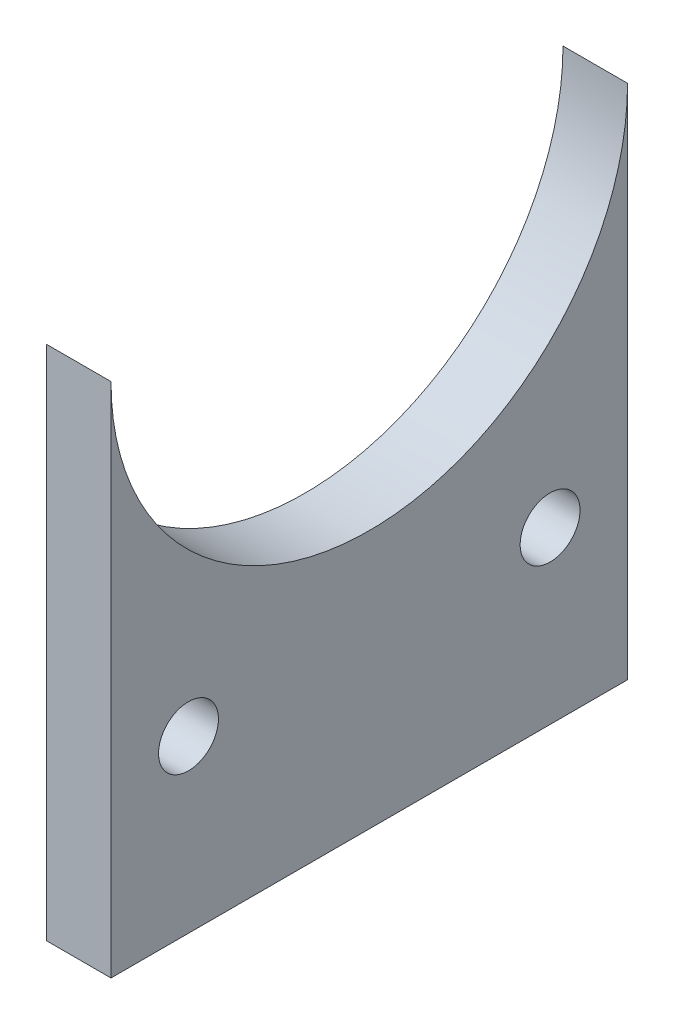
ISO-10303-21;
HEADER;
FILE_DESCRIPTION(('STEP AP214'),'2;1');
FILE_NAME('part.step','',(''),(''),'','','');
FILE_SCHEMA(('AUTOMOTIVE_DESIGN { 1 0 10303 214 1 1 1 1 }'));
ENDSEC;
DATA;
#1=APPLICATION_CONTEXT('core data for automotive mechanical design processes');
#2=APPLICATION_PROTOCOL_DEFINITION('international standard','automotive_design',2000,#1);
#3=PRODUCT_CONTEXT('',#1,'mechanical');
#4=PRODUCT('Part','Part','',(#3));
#5=PRODUCT_RELATED_PRODUCT_CATEGORY('part','',(#4));
#6=PRODUCT_DEFINITION_FORMATION('','',#4);
#7=PRODUCT_DEFINITION_CONTEXT('part definition',#1,'design');
#8=PRODUCT_DEFINITION('design','',#6,#7);
#9=PRODUCT_DEFINITION_SHAPE('','',#8);
#10=(LENGTH_UNIT() NAMED_UNIT(*) SI_UNIT(.MILLI.,.METRE.));
#11=(NAMED_UNIT(*) PLANE_ANGLE_UNIT() SI_UNIT($,.RADIAN.));
#12=(NAMED_UNIT(*) SI_UNIT($,.STERADIAN.) SOLID_ANGLE_UNIT());
#13=UNCERTAINTY_MEASURE_WITH_UNIT(LENGTH_MEASURE(1.E-05),#10,'distance_accuracy_value','');
#14=(GEOMETRIC_REPRESENTATION_CONTEXT(3) GLOBAL_UNCERTAINTY_ASSIGNED_CONTEXT((#13)) GLOBAL_UNIT_ASSIGNED_CONTEXT((#10,
#11,#12)) REPRESENTATION_CONTEXT('',''));
#15=CARTESIAN_POINT('',(0.,0.,0.));
#16=DIRECTION('',(0.,0.,1.));
#17=DIRECTION('',(1.,0.,0.));
#18=AXIS2_PLACEMENT_3D('',#15,#16,#17);
#19=CARTESIAN_POINT('',(3.175,12.7,0.));
#20=DIRECTION('',(-1.,0.,0.));
#21=DIRECTION('',(0.,0.,1.));
#22=AXIS2_PLACEMENT_3D('',#19,#20,#21);
#23=CYLINDRICAL_SURFACE('',#22,12.7);
#24=CARTESIAN_POINT('',(0.,12.7,0.));
#25=DIRECTION('',(-1.,0.,0.));
#26=DIRECTION('',(0.,0.,-1.));
#27=AXIS2_PLACEMENT_3D('',#24,#25,#26);
#28=CIRCLE('',#27,12.7);
#29=CARTESIAN_POINT('',(0.,12.7,-12.7));
#30=VERTEX_POINT('',#29);
#31=CARTESIAN_POINT('',(0.,12.7,12.7));
#32=VERTEX_POINT('',#31);
#33=EDGE_CURVE('E105',#30,#32,#28,.T.);
#34=ORIENTED_EDGE('',*,*,#33,.T.);
#35=DIRECTION('',(-1.,0.,0.));
#36=VECTOR('',#35,1.);
#37=CARTESIAN_POINT('',(3.175,12.7,12.7));
#38=LINE('',#37,#36);
#39=CARTESIAN_POINT('',(3.175,12.7,12.7));
#40=VERTEX_POINT('',#39);
#41=EDGE_CURVE('E11',#40,#32,#38,.T.);
#42=ORIENTED_EDGE('',*,*,#41,.F.);
#43=CARTESIAN_POINT('',(3.175,12.7,0.));
#44=DIRECTION('',(-1.,0.,0.));
#45=DIRECTION('',(0.,0.,-1.));
#46=AXIS2_PLACEMENT_3D('',#43,#44,#45);
#47=CIRCLE('',#46,12.7);
#48=CARTESIAN_POINT('',(3.175,12.7,-12.7));
#49=VERTEX_POINT('',#48);
#50=EDGE_CURVE('E92',#49,#40,#47,.T.);
#51=ORIENTED_EDGE('',*,*,#50,.F.);
#52=DIRECTION('',(-1.,0.,0.));
#53=VECTOR('',#52,1.);
#54=CARTESIAN_POINT('',(3.175,12.7,-12.7));
#55=LINE('',#54,#53);
#56=EDGE_CURVE('E101',#49,#30,#55,.T.);
#57=ORIENTED_EDGE('',*,*,#56,.T.);
#58=EDGE_LOOP('',(#34,#42,#51,#57));
#59=FACE_BOUND('',#58,.T.);
#60=ADVANCED_FACE('F39',(#59),#23,.F.);
#61=CARTESIAN_POINT('',(3.175,-12.7,12.7));
#62=DIRECTION('',(0.,0.,-1.));
#63=DIRECTION('',(-1.,0.,0.));
#64=AXIS2_PLACEMENT_3D('',#61,#62,#63);
#65=PLANE('',#64);
#66=DIRECTION('',(0.,-1.,0.));
#67=VECTOR('',#66,1.);
#68=CARTESIAN_POINT('',(0.,-12.7,12.7));
#69=LINE('',#68,#67);
#70=CARTESIAN_POINT('',(0.,-12.7,12.7));
#71=VERTEX_POINT('',#70);
#72=EDGE_CURVE('E96',#32,#71,#69,.T.);
#73=ORIENTED_EDGE('',*,*,#72,.T.);
#74=DIRECTION('',(-1.,0.,0.));
#75=VECTOR('',#74,1.);
#76=CARTESIAN_POINT('',(3.175,-12.7,12.7));
#77=LINE('',#76,#75);
#78=CARTESIAN_POINT('',(3.175,-12.7,12.7));
#79=VERTEX_POINT('',#78);
#80=EDGE_CURVE('E48',#79,#71,#77,.T.);
#81=ORIENTED_EDGE('',*,*,#80,.F.);
#82=DIRECTION('',(0.,-1.,0.));
#83=VECTOR('',#82,1.);
#84=CARTESIAN_POINT('',(3.175,-12.7,12.7));
#85=LINE('',#84,#83);
#86=EDGE_CURVE('E87',#40,#79,#85,.T.);
#87=ORIENTED_EDGE('',*,*,#86,.F.);
#88=ORIENTED_EDGE('',*,*,#41,.T.);
#89=EDGE_LOOP('',(#73,#81,#87,#88));
#90=FACE_BOUND('',#89,.T.);
#91=ADVANCED_FACE('F95',(#90),#65,.F.);
#92=CARTESIAN_POINT('',(3.175,-12.7,12.7));
#93=DIRECTION('',(0.,1.,0.));
#94=DIRECTION('',(0.,0.,1.));
#95=AXIS2_PLACEMENT_3D('',#92,#93,#94);
#96=PLANE('',#95);
#97=DIRECTION('',(0.,0.,-1.));
#98=VECTOR('',#97,1.);
#99=CARTESIAN_POINT('',(0.,-12.7,12.7));
#100=LINE('',#99,#98);
#101=CARTESIAN_POINT('',(0.,-12.7,-12.7));
#102=VERTEX_POINT('',#101);
#103=EDGE_CURVE('E74',#71,#102,#100,.T.);
#104=ORIENTED_EDGE('',*,*,#103,.T.);
#105=DIRECTION('',(-1.,0.,0.));
#106=VECTOR('',#105,1.);
#107=CARTESIAN_POINT('',(3.175,-12.7,-12.7));
#108=LINE('',#107,#106);
#109=CARTESIAN_POINT('',(3.175,-12.7,-12.7));
#110=VERTEX_POINT('',#109);
#111=EDGE_CURVE('E97',#110,#102,#108,.T.);
#112=ORIENTED_EDGE('',*,*,#111,.F.);
#113=DIRECTION('',(0.,0.,-1.));
#114=VECTOR('',#113,1.);
#115=CARTESIAN_POINT('',(3.175,-12.7,12.7));
#116=LINE('',#115,#114);
#117=EDGE_CURVE('E90',#79,#110,#116,.T.);
#118=ORIENTED_EDGE('',*,*,#117,.F.);
#119=ORIENTED_EDGE('',*,*,#80,.T.);
#120=EDGE_LOOP('',(#104,#112,#118,#119));
#121=FACE_BOUND('',#120,.T.);
#122=ADVANCED_FACE('F99',(#121),#96,.F.);
#123=CARTESIAN_POINT('',(3.175,-12.7,-12.7));
#124=DIRECTION('',(0.,0.,1.));
#125=DIRECTION('',(0.,-1.,0.));
#126=AXIS2_PLACEMENT_3D('',#123,#124,#125);
#127=PLANE('',#126);
#128=DIRECTION('',(0.,1.,0.));
#129=VECTOR('',#128,1.);
#130=CARTESIAN_POINT('',(0.,-12.7,-12.7));
#131=LINE('',#130,#129);
#132=EDGE_CURVE('E80',#102,#30,#131,.T.);
#133=ORIENTED_EDGE('',*,*,#132,.T.);
#134=ORIENTED_EDGE('',*,*,#56,.F.);
#135=DIRECTION('',(0.,1.,0.));
#136=VECTOR('',#135,1.);
#137=CARTESIAN_POINT('',(3.175,-12.7,-12.7));
#138=LINE('',#137,#136);
#139=EDGE_CURVE('E57',#110,#49,#138,.T.);
#140=ORIENTED_EDGE('',*,*,#139,.F.);
#141=ORIENTED_EDGE('',*,*,#111,.T.);
#142=EDGE_LOOP('',(#133,#134,#140,#141));
#143=FACE_BOUND('',#142,.T.);
#144=ADVANCED_FACE('F132',(#143),#127,.F.);
#145=CARTESIAN_POINT('',(3.175,12.7,0.));
#146=DIRECTION('',(1.,0.,0.));
#147=DIRECTION('',(0.,0.,-1.));
#148=AXIS2_PLACEMENT_3D('',#145,#146,#147);
#149=PLANE('',#148);
#150=CARTESIAN_POINT('',(3.175,-4.30895018450539,8.88994184738934));
#151=DIRECTION('',(1.,0.,0.));
#152=DIRECTION('',(0.,0.,-1.));
#153=AXIS2_PLACEMENT_3D('',#150,#151,#152);
#154=CIRCLE('',#153,1.47319693101347);
#155=CARTESIAN_POINT('',(3.175,-4.30895018450539,7.41674491637587));
#156=VERTEX_POINT('',#155);
#157=EDGE_CURVE('E122',#156,#156,#154,.T.);
#158=ORIENTED_EDGE('',*,*,#157,.F.);
#159=EDGE_LOOP('',(#158));
#160=FACE_BOUND('',#159,.T.);
#161=CARTESIAN_POINT('',(3.175,-4.30895018450539,-8.88994184738934));
#162=DIRECTION('',(-1.,0.,0.));
#163=DIRECTION('',(0.,0.,1.));
#164=AXIS2_PLACEMENT_3D('',#161,#162,#163);
#165=CIRCLE('',#164,1.47319693101347);
#166=CARTESIAN_POINT('',(3.175,-4.30895018450539,-7.41674491637587));
#167=VERTEX_POINT('',#166);
#168=EDGE_CURVE('E114',#167,#167,#165,.T.);
#169=ORIENTED_EDGE('',*,*,#168,.T.);
#170=EDGE_LOOP('',(#169));
#171=FACE_BOUND('',#170,.T.);
#172=ORIENTED_EDGE('',*,*,#50,.T.);
#173=ORIENTED_EDGE('',*,*,#86,.T.);
#174=ORIENTED_EDGE('',*,*,#117,.T.);
#175=ORIENTED_EDGE('',*,*,#139,.T.);
#176=EDGE_LOOP('',(#172,#173,#174,#175));
#177=FACE_BOUND('',#176,.T.);
#178=ADVANCED_FACE('F88',(#160,#171,#177),#149,.T.);
#179=CARTESIAN_POINT('',(0.,12.7,0.));
#180=DIRECTION('',(1.,0.,0.));
#181=DIRECTION('',(0.,0.,-1.));
#182=AXIS2_PLACEMENT_3D('',#179,#180,#181);
#183=PLANE('',#182);
#184=CARTESIAN_POINT('',(0.,-4.30895018450539,8.88994184738934));
#185=DIRECTION('',(1.,0.,0.));
#186=DIRECTION('',(0.,0.,-1.));
#187=AXIS2_PLACEMENT_3D('',#184,#185,#186);
#188=CIRCLE('',#187,1.47319693101347);
#189=CARTESIAN_POINT('',(0.,-4.30895018450539,7.41674491637587));
#190=VERTEX_POINT('',#189);
#191=EDGE_CURVE('E42',#190,#190,#188,.F.);
#192=ORIENTED_EDGE('',*,*,#191,.F.);
#193=EDGE_LOOP('',(#192));
#194=FACE_BOUND('',#193,.T.);
#195=CARTESIAN_POINT('',(0.,-4.30895018450539,-8.88994184738934));
#196=DIRECTION('',(1.,0.,0.));
#197=DIRECTION('',(0.,0.,-1.));
#198=AXIS2_PLACEMENT_3D('',#195,#196,#197);
#199=CIRCLE('',#198,1.47319693101347);
#200=CARTESIAN_POINT('',(0.,-4.30895018450539,-10.3631387784028));
#201=VERTEX_POINT('',#200);
#202=EDGE_CURVE('E108',#201,#201,#199,.T.);
#203=ORIENTED_EDGE('',*,*,#202,.T.);
#204=EDGE_LOOP('',(#203));
#205=FACE_BOUND('',#204,.T.);
#206=ORIENTED_EDGE('',*,*,#33,.F.);
#207=ORIENTED_EDGE('',*,*,#132,.F.);
#208=ORIENTED_EDGE('',*,*,#103,.F.);
#209=ORIENTED_EDGE('',*,*,#72,.F.);
#210=EDGE_LOOP('',(#206,#207,#208,#209));
#211=FACE_BOUND('',#210,.T.);
#212=ADVANCED_FACE('F131',(#194,#205,#211),#183,.F.);
#213=CARTESIAN_POINT('',(3.175,-4.30895018450539,-8.88994184738934));
#214=DIRECTION('',(-1.,0.,0.));
#215=DIRECTION('',(0.,0.,1.));
#216=AXIS2_PLACEMENT_3D('',#213,#214,#215);
#217=CYLINDRICAL_SURFACE('',#216,1.47319693101347);
#218=ORIENTED_EDGE('',*,*,#168,.F.);
#219=EDGE_LOOP('',(#218));
#220=FACE_BOUND('',#219,.T.);
#221=ORIENTED_EDGE('',*,*,#202,.F.);
#222=EDGE_LOOP('',(#221));
#223=FACE_BOUND('',#222,.T.);
#224=ADVANCED_FACE('F138',(#220,#223),#217,.F.);
#225=CARTESIAN_POINT('',(3.175,-4.30895018450539,8.88994184738934));
#226=DIRECTION('',(-1.,0.,0.));
#227=DIRECTION('',(0.,0.,1.));
#228=AXIS2_PLACEMENT_3D('',#225,#226,#227);
#229=CYLINDRICAL_SURFACE('',#228,1.47319693101347);
#230=ORIENTED_EDGE('',*,*,#157,.T.);
#231=EDGE_LOOP('',(#230));
#232=FACE_BOUND('',#231,.T.);
#233=ORIENTED_EDGE('',*,*,#191,.T.);
#234=EDGE_LOOP('',(#233));
#235=FACE_BOUND('',#234,.T.);
#236=ADVANCED_FACE('F127',(#232,#235),#229,.F.);
#237=CLOSED_SHELL('',(#60,#91,#122,#144,#178,#212,#224,#236));
#238=MANIFOLD_SOLID_BREP('B2',#237);
#239=ADVANCED_BREP_SHAPE_REPRESENTATION('',(#18,#238),#14);
#240=SHAPE_DEFINITION_REPRESENTATION(#9,#239);
ENDSEC;
END-ISO-10303-21;
